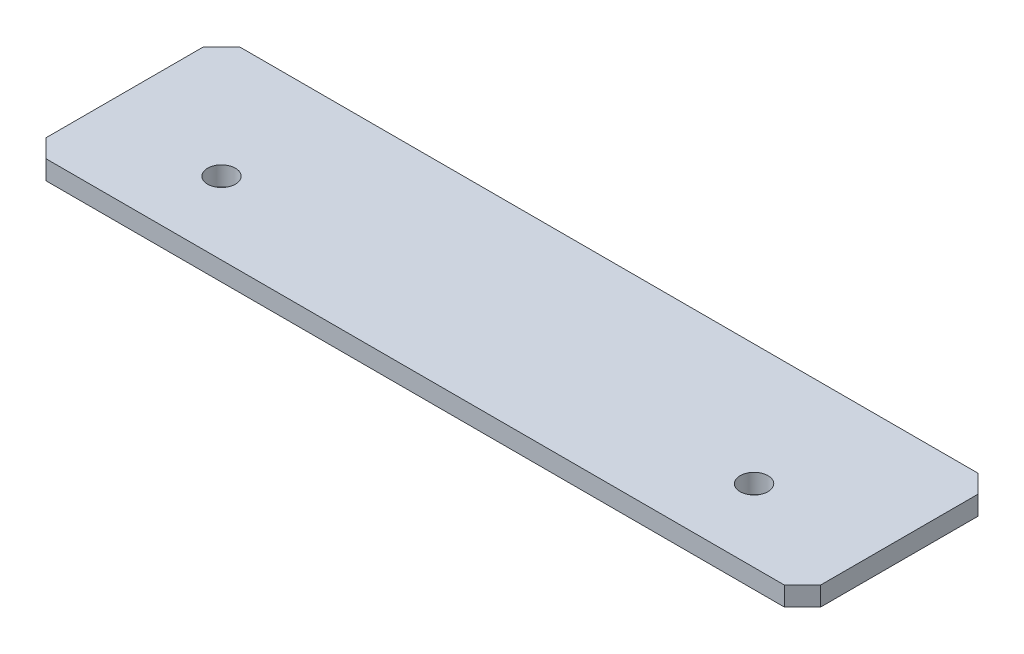
ISO-10303-21;
HEADER;
FILE_DESCRIPTION(('STEP AP214'),'2;1');
FILE_NAME('part.step','',(''),(''),'','','');
FILE_SCHEMA(('AUTOMOTIVE_DESIGN { 1 0 10303 214 1 1 1 1 }'));
ENDSEC;
DATA;
#1=APPLICATION_CONTEXT('core data for automotive mechanical design processes');
#2=APPLICATION_PROTOCOL_DEFINITION('international standard','automotive_design',2000,#1);
#3=PRODUCT_CONTEXT('',#1,'mechanical');
#4=PRODUCT('Part','Part','',(#3));
#5=PRODUCT_RELATED_PRODUCT_CATEGORY('part','',(#4));
#6=PRODUCT_DEFINITION_FORMATION('','',#4);
#7=PRODUCT_DEFINITION_CONTEXT('part definition',#1,'design');
#8=PRODUCT_DEFINITION('design','',#6,#7);
#9=PRODUCT_DEFINITION_SHAPE('','',#8);
#10=(LENGTH_UNIT() NAMED_UNIT(*) SI_UNIT(.MILLI.,.METRE.));
#11=(NAMED_UNIT(*) PLANE_ANGLE_UNIT() SI_UNIT($,.RADIAN.));
#12=(NAMED_UNIT(*) SI_UNIT($,.STERADIAN.) SOLID_ANGLE_UNIT());
#13=UNCERTAINTY_MEASURE_WITH_UNIT(LENGTH_MEASURE(1.E-05),#10,'distance_accuracy_value','');
#14=(GEOMETRIC_REPRESENTATION_CONTEXT(3) GLOBAL_UNCERTAINTY_ASSIGNED_CONTEXT((#13)) GLOBAL_UNIT_ASSIGNED_CONTEXT((#10,
#11,#12)) REPRESENTATION_CONTEXT('',''));
#15=CARTESIAN_POINT('',(0.,0.,0.));
#16=DIRECTION('',(0.,0.,1.));
#17=DIRECTION('',(1.,0.,0.));
#18=AXIS2_PLACEMENT_3D('',#15,#16,#17);
#19=CARTESIAN_POINT('',(0.,7.9,0.));
#20=DIRECTION('',(0.,-1.,0.));
#21=DIRECTION('',(0.,0.,-1.));
#22=AXIS2_PLACEMENT_3D('',#19,#20,#21);
#23=PLANE('',#22);
#24=DIRECTION('',(-1.,0.,0.));
#25=VECTOR('',#24,1.);
#26=CARTESIAN_POINT('',(-305.,7.9,-80.));
#27=LINE('',#26,#25);
#28=CARTESIAN_POINT('',(305.,7.9,-80.));
#29=VERTEX_POINT('',#28);
#30=CARTESIAN_POINT('',(-305.,7.9,-80.));
#31=VERTEX_POINT('',#30);
#32=EDGE_CURVE('E151',#29,#31,#27,.T.);
#33=ORIENTED_EDGE('',*,*,#32,.T.);
#34=DIRECTION('',(-0.707106781186548,0.,0.707106781186547));
#35=VECTOR('',#34,1.);
#36=CARTESIAN_POINT('',(-320.,7.9,-65.0000000000001));
#37=LINE('',#36,#35);
#38=CARTESIAN_POINT('',(-320.,7.9,-65.0000000000001));
#39=VERTEX_POINT('',#38);
#40=EDGE_CURVE('E99',#31,#39,#37,.T.);
#41=ORIENTED_EDGE('',*,*,#40,.T.);
#42=DIRECTION('',(0.,0.,1.));
#43=VECTOR('',#42,1.);
#44=CARTESIAN_POINT('',(-320.,7.9,-65.0000000000001));
#45=LINE('',#44,#43);
#46=CARTESIAN_POINT('',(-320.,7.9,64.9999999999999));
#47=VERTEX_POINT('',#46);
#48=EDGE_CURVE('E166',#39,#47,#45,.T.);
#49=ORIENTED_EDGE('',*,*,#48,.T.);
#50=DIRECTION('',(0.707106781186546,0.,0.707106781186549));
#51=VECTOR('',#50,1.);
#52=CARTESIAN_POINT('',(-320.,7.9,64.9999999999999));
#53=LINE('',#52,#51);
#54=CARTESIAN_POINT('',(-305.,7.9,80.));
#55=VERTEX_POINT('',#54);
#56=EDGE_CURVE('E179',#47,#55,#53,.T.);
#57=ORIENTED_EDGE('',*,*,#56,.T.);
#58=DIRECTION('',(1.,0.,0.));
#59=VECTOR('',#58,1.);
#60=CARTESIAN_POINT('',(-305.,7.9,80.));
#61=LINE('',#60,#59);
#62=CARTESIAN_POINT('',(305.,7.9,80.));
#63=VERTEX_POINT('',#62);
#64=EDGE_CURVE('E118',#55,#63,#61,.T.);
#65=ORIENTED_EDGE('',*,*,#64,.T.);
#66=DIRECTION('',(0.707106781186546,0.,-0.70710678118655));
#67=VECTOR('',#66,1.);
#68=CARTESIAN_POINT('',(305.,7.9,80.));
#69=LINE('',#68,#67);
#70=CARTESIAN_POINT('',(320.,7.9,64.9999999999999));
#71=VERTEX_POINT('',#70);
#72=EDGE_CURVE('E112',#63,#71,#69,.T.);
#73=ORIENTED_EDGE('',*,*,#72,.T.);
#74=DIRECTION('',(0.,0.,-1.));
#75=VECTOR('',#74,1.);
#76=CARTESIAN_POINT('',(320.,7.9,-65.0000000000001));
#77=LINE('',#76,#75);
#78=CARTESIAN_POINT('',(320.,7.9,-65.0000000000001));
#79=VERTEX_POINT('',#78);
#80=EDGE_CURVE('E116',#71,#79,#77,.T.);
#81=ORIENTED_EDGE('',*,*,#80,.T.);
#82=DIRECTION('',(-0.707106781186548,0.,-0.707106781186547));
#83=VECTOR('',#82,1.);
#84=CARTESIAN_POINT('',(305.,7.9,-80.));
#85=LINE('',#84,#83);
#86=EDGE_CURVE('E56',#79,#29,#85,.T.);
#87=ORIENTED_EDGE('',*,*,#86,.T.);
#88=EDGE_LOOP('',(#33,#41,#49,#57,#65,#73,#81,#87));
#89=FACE_BOUND('',#88,.T.);
#90=CARTESIAN_POINT('',(-220.,7.9,20.));
#91=DIRECTION('',(0.,1.,0.));
#92=DIRECTION('',(0.,0.,1.));
#93=AXIS2_PLACEMENT_3D('',#90,#91,#92);
#94=CIRCLE('',#93,11.5);
#95=CARTESIAN_POINT('',(-220.,7.9,31.5));
#96=VERTEX_POINT('',#95);
#97=EDGE_CURVE('E140',#96,#96,#94,.T.);
#98=ORIENTED_EDGE('',*,*,#97,.F.);
#99=EDGE_LOOP('',(#98));
#100=FACE_BOUND('',#99,.T.);
#101=CARTESIAN_POINT('',(220.,7.9,20.));
#102=DIRECTION('',(0.,1.,0.));
#103=DIRECTION('',(0.,0.,1.));
#104=AXIS2_PLACEMENT_3D('',#101,#102,#103);
#105=CIRCLE('',#104,11.5);
#106=CARTESIAN_POINT('',(220.,7.9,31.5));
#107=VERTEX_POINT('',#106);
#108=EDGE_CURVE('E188',#107,#107,#105,.T.);
#109=ORIENTED_EDGE('',*,*,#108,.F.);
#110=EDGE_LOOP('',(#109));
#111=FACE_BOUND('',#110,.T.);
#112=ADVANCED_FACE('F39',(#89,#100,#111),#23,.F.);
#113=CARTESIAN_POINT('',(0.,-7.9,0.));
#114=DIRECTION('',(0.,-1.,0.));
#115=DIRECTION('',(0.,0.,-1.));
#116=AXIS2_PLACEMENT_3D('',#113,#114,#115);
#117=PLANE('',#116);
#118=CARTESIAN_POINT('',(-220.,-7.9,20.));
#119=DIRECTION('',(0.,1.,0.));
#120=DIRECTION('',(0.,0.,1.));
#121=AXIS2_PLACEMENT_3D('',#118,#119,#120);
#122=CIRCLE('',#121,11.5);
#123=CARTESIAN_POINT('',(-220.,-7.9,31.5));
#124=VERTEX_POINT('',#123);
#125=EDGE_CURVE('E185',#124,#124,#122,.T.);
#126=ORIENTED_EDGE('',*,*,#125,.T.);
#127=EDGE_LOOP('',(#126));
#128=FACE_BOUND('',#127,.T.);
#129=DIRECTION('',(-1.,0.,0.));
#130=VECTOR('',#129,1.);
#131=CARTESIAN_POINT('',(-305.,-7.9,-80.));
#132=LINE('',#131,#130);
#133=CARTESIAN_POINT('',(305.,-7.9,-80.));
#134=VERTEX_POINT('',#133);
#135=CARTESIAN_POINT('',(-305.,-7.9,-80.));
#136=VERTEX_POINT('',#135);
#137=EDGE_CURVE('E136',#134,#136,#132,.T.);
#138=ORIENTED_EDGE('',*,*,#137,.F.);
#139=DIRECTION('',(-0.707106781186548,0.,-0.707106781186547));
#140=VECTOR('',#139,1.);
#141=CARTESIAN_POINT('',(305.,-7.9,-80.));
#142=LINE('',#141,#140);
#143=CARTESIAN_POINT('',(320.,-7.9,-65.0000000000001));
#144=VERTEX_POINT('',#143);
#145=EDGE_CURVE('E91',#144,#134,#142,.T.);
#146=ORIENTED_EDGE('',*,*,#145,.F.);
#147=DIRECTION('',(0.,0.,-1.));
#148=VECTOR('',#147,1.);
#149=CARTESIAN_POINT('',(320.,-7.9,-65.0000000000001));
#150=LINE('',#149,#148);
#151=CARTESIAN_POINT('',(320.,-7.9,64.9999999999999));
#152=VERTEX_POINT('',#151);
#153=EDGE_CURVE('E85',#152,#144,#150,.T.);
#154=ORIENTED_EDGE('',*,*,#153,.F.);
#155=DIRECTION('',(0.707106781186546,0.,-0.70710678118655));
#156=VECTOR('',#155,1.);
#157=CARTESIAN_POINT('',(305.,-7.9,80.));
#158=LINE('',#157,#156);
#159=CARTESIAN_POINT('',(305.,-7.9,80.));
#160=VERTEX_POINT('',#159);
#161=EDGE_CURVE('E126',#160,#152,#158,.T.);
#162=ORIENTED_EDGE('',*,*,#161,.F.);
#163=DIRECTION('',(1.,0.,0.));
#164=VECTOR('',#163,1.);
#165=CARTESIAN_POINT('',(-305.,-7.9,80.));
#166=LINE('',#165,#164);
#167=CARTESIAN_POINT('',(-305.,-7.9,80.));
#168=VERTEX_POINT('',#167);
#169=EDGE_CURVE('E146',#168,#160,#166,.T.);
#170=ORIENTED_EDGE('',*,*,#169,.F.);
#171=DIRECTION('',(0.707106781186546,0.,0.707106781186549));
#172=VECTOR('',#171,1.);
#173=CARTESIAN_POINT('',(-320.,-7.9,64.9999999999999));
#174=LINE('',#173,#172);
#175=CARTESIAN_POINT('',(-320.,-7.9,64.9999999999999));
#176=VERTEX_POINT('',#175);
#177=EDGE_CURVE('E144',#176,#168,#174,.T.);
#178=ORIENTED_EDGE('',*,*,#177,.F.);
#179=DIRECTION('',(0.,0.,1.));
#180=VECTOR('',#179,1.);
#181=CARTESIAN_POINT('',(-320.,-7.9,-65.0000000000001));
#182=LINE('',#181,#180);
#183=CARTESIAN_POINT('',(-320.,-7.9,-65.0000000000001));
#184=VERTEX_POINT('',#183);
#185=EDGE_CURVE('E142',#184,#176,#182,.T.);
#186=ORIENTED_EDGE('',*,*,#185,.F.);
#187=DIRECTION('',(-0.707106781186548,0.,0.707106781186547));
#188=VECTOR('',#187,1.);
#189=CARTESIAN_POINT('',(-320.,-7.9,-65.0000000000001));
#190=LINE('',#189,#188);
#191=EDGE_CURVE('E139',#136,#184,#190,.T.);
#192=ORIENTED_EDGE('',*,*,#191,.F.);
#193=EDGE_LOOP('',(#138,#146,#154,#162,#170,#178,#186,#192));
#194=FACE_BOUND('',#193,.T.);
#195=CARTESIAN_POINT('',(220.,-7.9,20.));
#196=DIRECTION('',(0.,1.,0.));
#197=DIRECTION('',(0.,0.,1.));
#198=AXIS2_PLACEMENT_3D('',#195,#196,#197);
#199=CIRCLE('',#198,11.5);
#200=CARTESIAN_POINT('',(220.,-7.9,31.5));
#201=VERTEX_POINT('',#200);
#202=EDGE_CURVE('E191',#201,#201,#199,.T.);
#203=ORIENTED_EDGE('',*,*,#202,.T.);
#204=EDGE_LOOP('',(#203));
#205=FACE_BOUND('',#204,.T.);
#206=ADVANCED_FACE('F170',(#128,#194,#205),#117,.T.);
#207=CARTESIAN_POINT('',(-305.,7.9,-80.));
#208=DIRECTION('',(0.,0.,1.));
#209=DIRECTION('',(1.,0.,0.));
#210=AXIS2_PLACEMENT_3D('',#207,#208,#209);
#211=PLANE('',#210);
#212=ORIENTED_EDGE('',*,*,#137,.T.);
#213=DIRECTION('',(0.,-1.,0.));
#214=VECTOR('',#213,1.);
#215=CARTESIAN_POINT('',(-305.,7.9,-80.));
#216=LINE('',#215,#214);
#217=EDGE_CURVE('E11',#31,#136,#216,.T.);
#218=ORIENTED_EDGE('',*,*,#217,.F.);
#219=ORIENTED_EDGE('',*,*,#32,.F.);
#220=DIRECTION('',(0.,-1.,0.));
#221=VECTOR('',#220,1.);
#222=CARTESIAN_POINT('',(305.,7.9,-80.));
#223=LINE('',#222,#221);
#224=EDGE_CURVE('E132',#29,#134,#223,.T.);
#225=ORIENTED_EDGE('',*,*,#224,.T.);
#226=EDGE_LOOP('',(#212,#218,#219,#225));
#227=FACE_BOUND('',#226,.T.);
#228=ADVANCED_FACE('F41',(#227),#211,.F.);
#229=CARTESIAN_POINT('',(-320.,7.9,-65.0000000000001));
#230=DIRECTION('',(0.707106781186547,0.,0.707106781186548));
#231=DIRECTION('',(0.707106781186548,0.,-0.707106781186547));
#232=AXIS2_PLACEMENT_3D('',#229,#230,#231);
#233=PLANE('',#232);
#234=ORIENTED_EDGE('',*,*,#191,.T.);
#235=DIRECTION('',(0.,-1.,0.));
#236=VECTOR('',#235,1.);
#237=CARTESIAN_POINT('',(-320.,7.9,-65.0000000000001));
#238=LINE('',#237,#236);
#239=EDGE_CURVE('E48',#39,#184,#238,.T.);
#240=ORIENTED_EDGE('',*,*,#239,.F.);
#241=ORIENTED_EDGE('',*,*,#40,.F.);
#242=ORIENTED_EDGE('',*,*,#217,.T.);
#243=EDGE_LOOP('',(#234,#240,#241,#242));
#244=FACE_BOUND('',#243,.T.);
#245=ADVANCED_FACE('F223',(#244),#233,.F.);
#246=CARTESIAN_POINT('',(-320.,7.9,-65.0000000000001));
#247=DIRECTION('',(1.,0.,0.));
#248=DIRECTION('',(0.,0.,-1.));
#249=AXIS2_PLACEMENT_3D('',#246,#247,#248);
#250=PLANE('',#249);
#251=ORIENTED_EDGE('',*,*,#185,.T.);
#252=DIRECTION('',(0.,-1.,0.));
#253=VECTOR('',#252,1.);
#254=CARTESIAN_POINT('',(-320.,7.9,64.9999999999999));
#255=LINE('',#254,#253);
#256=EDGE_CURVE('E158',#47,#176,#255,.T.);
#257=ORIENTED_EDGE('',*,*,#256,.F.);
#258=ORIENTED_EDGE('',*,*,#48,.F.);
#259=ORIENTED_EDGE('',*,*,#239,.T.);
#260=EDGE_LOOP('',(#251,#257,#258,#259));
#261=FACE_BOUND('',#260,.T.);
#262=ADVANCED_FACE('F164',(#261),#250,.F.);
#263=CARTESIAN_POINT('',(-320.,7.9,64.9999999999999));
#264=DIRECTION('',(0.707106781186549,0.,-0.707106781186546));
#265=DIRECTION('',(-0.707106781186546,0.,-0.707106781186549));
#266=AXIS2_PLACEMENT_3D('',#263,#264,#265);
#267=PLANE('',#266);
#268=ORIENTED_EDGE('',*,*,#177,.T.);
#269=DIRECTION('',(0.,-1.,0.));
#270=VECTOR('',#269,1.);
#271=CARTESIAN_POINT('',(-305.,7.9,80.));
#272=LINE('',#271,#270);
#273=EDGE_CURVE('E155',#55,#168,#272,.T.);
#274=ORIENTED_EDGE('',*,*,#273,.F.);
#275=ORIENTED_EDGE('',*,*,#56,.F.);
#276=ORIENTED_EDGE('',*,*,#256,.T.);
#277=EDGE_LOOP('',(#268,#274,#275,#276));
#278=FACE_BOUND('',#277,.T.);
#279=ADVANCED_FACE('F175',(#278),#267,.F.);
#280=CARTESIAN_POINT('',(-305.,7.9,80.));
#281=DIRECTION('',(0.,0.,-1.));
#282=DIRECTION('',(-1.,0.,0.));
#283=AXIS2_PLACEMENT_3D('',#280,#281,#282);
#284=PLANE('',#283);
#285=ORIENTED_EDGE('',*,*,#169,.T.);
#286=DIRECTION('',(0.,-1.,0.));
#287=VECTOR('',#286,1.);
#288=CARTESIAN_POINT('',(305.,7.9,80.));
#289=LINE('',#288,#287);
#290=EDGE_CURVE('E127',#63,#160,#289,.T.);
#291=ORIENTED_EDGE('',*,*,#290,.F.);
#292=ORIENTED_EDGE('',*,*,#64,.F.);
#293=ORIENTED_EDGE('',*,*,#273,.T.);
#294=EDGE_LOOP('',(#285,#291,#292,#293));
#295=FACE_BOUND('',#294,.T.);
#296=ADVANCED_FACE('F178',(#295),#284,.F.);
#297=CARTESIAN_POINT('',(305.,7.9,80.));
#298=DIRECTION('',(-0.70710678118655,0.,-0.707106781186546));
#299=DIRECTION('',(-0.707106781186546,0.,0.70710678118655));
#300=AXIS2_PLACEMENT_3D('',#297,#298,#299);
#301=PLANE('',#300);
#302=ORIENTED_EDGE('',*,*,#161,.T.);
#303=DIRECTION('',(0.,-1.,0.));
#304=VECTOR('',#303,1.);
#305=CARTESIAN_POINT('',(320.,7.9,64.9999999999999));
#306=LINE('',#305,#304);
#307=EDGE_CURVE('E123',#71,#152,#306,.T.);
#308=ORIENTED_EDGE('',*,*,#307,.F.);
#309=ORIENTED_EDGE('',*,*,#72,.F.);
#310=ORIENTED_EDGE('',*,*,#290,.T.);
#311=EDGE_LOOP('',(#302,#308,#309,#310));
#312=FACE_BOUND('',#311,.T.);
#313=ADVANCED_FACE('F124',(#312),#301,.F.);
#314=CARTESIAN_POINT('',(320.,7.9,-65.0000000000001));
#315=DIRECTION('',(-1.,0.,0.));
#316=DIRECTION('',(0.,0.,1.));
#317=AXIS2_PLACEMENT_3D('',#314,#315,#316);
#318=PLANE('',#317);
#319=ORIENTED_EDGE('',*,*,#153,.T.);
#320=DIRECTION('',(0.,-1.,0.));
#321=VECTOR('',#320,1.);
#322=CARTESIAN_POINT('',(320.,7.9,-65.0000000000001));
#323=LINE('',#322,#321);
#324=EDGE_CURVE('E128',#79,#144,#323,.T.);
#325=ORIENTED_EDGE('',*,*,#324,.F.);
#326=ORIENTED_EDGE('',*,*,#80,.F.);
#327=ORIENTED_EDGE('',*,*,#307,.T.);
#328=EDGE_LOOP('',(#319,#325,#326,#327));
#329=FACE_BOUND('',#328,.T.);
#330=ADVANCED_FACE('F130',(#329),#318,.F.);
#331=CARTESIAN_POINT('',(305.,7.9,-80.));
#332=DIRECTION('',(-0.707106781186547,0.,0.707106781186548));
#333=DIRECTION('',(0.707106781186548,0.,0.707106781186547));
#334=AXIS2_PLACEMENT_3D('',#331,#332,#333);
#335=PLANE('',#334);
#336=ORIENTED_EDGE('',*,*,#145,.T.);
#337=ORIENTED_EDGE('',*,*,#224,.F.);
#338=ORIENTED_EDGE('',*,*,#86,.F.);
#339=ORIENTED_EDGE('',*,*,#324,.T.);
#340=EDGE_LOOP('',(#336,#337,#338,#339));
#341=FACE_BOUND('',#340,.T.);
#342=ADVANCED_FACE('F211',(#341),#335,.F.);
#343=CARTESIAN_POINT('',(-220.,7.9,20.));
#344=DIRECTION('',(0.,-1.,0.));
#345=DIRECTION('',(0.,0.,-1.));
#346=AXIS2_PLACEMENT_3D('',#343,#344,#345);
#347=CYLINDRICAL_SURFACE('',#346,11.5);
#348=ORIENTED_EDGE('',*,*,#97,.T.);
#349=EDGE_LOOP('',(#348));
#350=FACE_BOUND('',#349,.T.);
#351=ORIENTED_EDGE('',*,*,#125,.F.);
#352=EDGE_LOOP('',(#351));
#353=FACE_BOUND('',#352,.T.);
#354=ADVANCED_FACE('F208',(#350,#353),#347,.F.);
#355=CARTESIAN_POINT('',(220.,7.9,20.));
#356=DIRECTION('',(0.,-1.,0.));
#357=DIRECTION('',(0.,0.,-1.));
#358=AXIS2_PLACEMENT_3D('',#355,#356,#357);
#359=CYLINDRICAL_SURFACE('',#358,11.5);
#360=ORIENTED_EDGE('',*,*,#108,.T.);
#361=EDGE_LOOP('',(#360));
#362=FACE_BOUND('',#361,.T.);
#363=ORIENTED_EDGE('',*,*,#202,.F.);
#364=EDGE_LOOP('',(#363));
#365=FACE_BOUND('',#364,.T.);
#366=ADVANCED_FACE('F197',(#362,#365),#359,.F.);
#367=CLOSED_SHELL('',(#112,#206,#228,#245,#262,#279,#296,#313,#330,#342,#354,#366));
#368=MANIFOLD_SOLID_BREP('B2',#367);
#369=ADVANCED_BREP_SHAPE_REPRESENTATION('',(#18,#368),#14);
#370=SHAPE_DEFINITION_REPRESENTATION(#9,#369);
ENDSEC;
END-ISO-10303-21;
